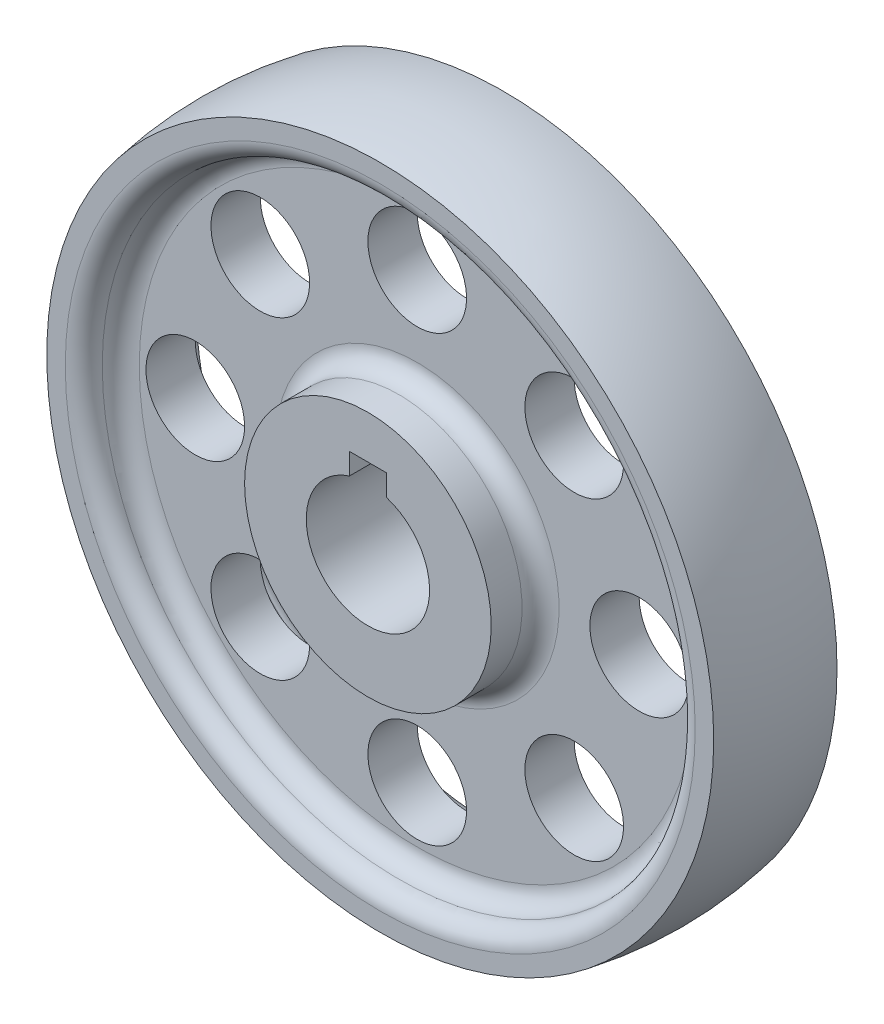
ISO-10303-21;
HEADER;
FILE_DESCRIPTION(('STEP AP214'),'2;1');
FILE_NAME('part.step','',(''),(''),'','','');
FILE_SCHEMA(('AUTOMOTIVE_DESIGN { 1 0 10303 214 1 1 1 1 }'));
ENDSEC;
DATA;
#1=APPLICATION_CONTEXT('core data for automotive mechanical design processes');
#2=APPLICATION_PROTOCOL_DEFINITION('international standard','automotive_design',2000,#1);
#3=PRODUCT_CONTEXT('',#1,'mechanical');
#4=PRODUCT('Part','Part','',(#3));
#5=PRODUCT_RELATED_PRODUCT_CATEGORY('part','',(#4));
#6=PRODUCT_DEFINITION_FORMATION('','',#4);
#7=PRODUCT_DEFINITION_CONTEXT('part definition',#1,'design');
#8=PRODUCT_DEFINITION('design','',#6,#7);
#9=PRODUCT_DEFINITION_SHAPE('','',#8);
#10=(LENGTH_UNIT() NAMED_UNIT(*) SI_UNIT(.MILLI.,.METRE.));
#11=(NAMED_UNIT(*) PLANE_ANGLE_UNIT() SI_UNIT($,.RADIAN.));
#12=(NAMED_UNIT(*) SI_UNIT($,.STERADIAN.) SOLID_ANGLE_UNIT());
#13=UNCERTAINTY_MEASURE_WITH_UNIT(LENGTH_MEASURE(1.E-05),#10,'distance_accuracy_value','');
#14=(GEOMETRIC_REPRESENTATION_CONTEXT(3) GLOBAL_UNCERTAINTY_ASSIGNED_CONTEXT((#13)) GLOBAL_UNIT_ASSIGNED_CONTEXT((#10,
#11,#12)) REPRESENTATION_CONTEXT('',''));
#15=CARTESIAN_POINT('',(0.,0.,0.));
#16=DIRECTION('',(0.,0.,1.));
#17=DIRECTION('',(1.,0.,0.));
#18=AXIS2_PLACEMENT_3D('',#15,#16,#17);
#19=CARTESIAN_POINT('',(0.,0.,0.));
#20=DIRECTION('',(0.,0.,1.));
#21=DIRECTION('',(1.,0.,0.));
#22=AXIS2_PLACEMENT_3D('',#19,#20,#21);
#23=PLANE('',#22);
#24=CARTESIAN_POINT('',(25.4558441227154,25.455844122716,0.));
#25=DIRECTION('',(0.,0.,-1.));
#26=DIRECTION('',(-0.707106781186556,0.707106781186539,0.));
#27=AXIS2_PLACEMENT_3D('',#24,#25,#26);
#28=CIRCLE('',#27,8.);
#29=CARTESIAN_POINT('',(19.7989898732229,31.1126983722083,0.));
#30=VERTEX_POINT('',#29);
#31=EDGE_CURVE('E262',#30,#30,#28,.T.);
#32=ORIENTED_EDGE('',*,*,#31,.F.);
#33=EDGE_LOOP('',(#32));
#34=FACE_BOUND('',#33,.T.);
#35=CARTESIAN_POINT('',(36.,3.77079984595058E-13,0.));
#36=DIRECTION('',(0.,0.,-1.));
#37=DIRECTION('',(0.,1.,0.));
#38=AXIS2_PLACEMENT_3D('',#35,#36,#37);
#39=CIRCLE('',#38,8.);
#40=CARTESIAN_POINT('',(35.9999999999999,8.00000000000038,0.));
#41=VERTEX_POINT('',#40);
#42=EDGE_CURVE('E256',#41,#41,#39,.T.);
#43=ORIENTED_EDGE('',*,*,#42,.F.);
#44=EDGE_LOOP('',(#43));
#45=FACE_BOUND('',#44,.T.);
#46=CARTESIAN_POINT('',(25.4558441227159,-25.4558441227155,0.));
#47=DIRECTION('',(0.,0.,-1.));
#48=DIRECTION('',(0.707106781186541,0.707106781186554,0.));
#49=AXIS2_PLACEMENT_3D('',#46,#47,#48);
#50=CIRCLE('',#49,8.);
#51=CARTESIAN_POINT('',(31.1126983722083,-19.7989898732231,0.));
#52=VERTEX_POINT('',#51);
#53=EDGE_CURVE('E250',#52,#52,#50,.T.);
#54=ORIENTED_EDGE('',*,*,#53,.F.);
#55=EDGE_LOOP('',(#54));
#56=FACE_BOUND('',#55,.T.);
#57=CARTESIAN_POINT('',(2.51386656396706E-13,-36.,0.));
#58=DIRECTION('',(0.,0.,-1.));
#59=DIRECTION('',(1.,0.,0.));
#60=AXIS2_PLACEMENT_3D('',#57,#58,#59);
#61=CIRCLE('',#60,8.);
#62=CARTESIAN_POINT('',(8.00000000000025,-35.9999999999999,0.));
#63=VERTEX_POINT('',#62);
#64=EDGE_CURVE('E244',#63,#63,#61,.T.);
#65=ORIENTED_EDGE('',*,*,#64,.F.);
#66=EDGE_LOOP('',(#65));
#67=FACE_BOUND('',#66,.T.);
#68=CARTESIAN_POINT('',(-25.4558441227156,-25.4558441227158,0.));
#69=DIRECTION('',(0.,0.,-1.));
#70=DIRECTION('',(0.707106781186551,-0.707106781186544,0.));
#71=AXIS2_PLACEMENT_3D('',#68,#69,#70);
#72=CIRCLE('',#71,8.);
#73=CARTESIAN_POINT('',(-19.7989898732232,-31.1126983722082,0.));
#74=VERTEX_POINT('',#73);
#75=EDGE_CURVE('E238',#74,#74,#72,.T.);
#76=ORIENTED_EDGE('',*,*,#75,.F.);
#77=EDGE_LOOP('',(#76));
#78=FACE_BOUND('',#77,.T.);
#79=CARTESIAN_POINT('',(-36.,-1.25693328198353E-13,0.));
#80=DIRECTION('',(0.,0.,-1.));
#81=DIRECTION('',(0.,-1.,0.));
#82=AXIS2_PLACEMENT_3D('',#79,#80,#81);
#83=CIRCLE('',#82,8.);
#84=CARTESIAN_POINT('',(-36.,-8.00000000000012,0.));
#85=VERTEX_POINT('',#84);
#86=EDGE_CURVE('E232',#85,#85,#83,.T.);
#87=ORIENTED_EDGE('',*,*,#86,.F.);
#88=EDGE_LOOP('',(#87));
#89=FACE_BOUND('',#88,.T.);
#90=CARTESIAN_POINT('',(-25.4558441227158,25.4558441227157,0.));
#91=DIRECTION('',(0.,0.,-1.));
#92=DIRECTION('',(-0.707106781186546,-0.707106781186549,0.));
#93=AXIS2_PLACEMENT_3D('',#90,#91,#92);
#94=CIRCLE('',#93,8.);
#95=CARTESIAN_POINT('',(-31.1126983722081,19.7989898732233,0.));
#96=VERTEX_POINT('',#95);
#97=EDGE_CURVE('E226',#96,#96,#94,.T.);
#98=ORIENTED_EDGE('',*,*,#97,.F.);
#99=EDGE_LOOP('',(#98));
#100=FACE_BOUND('',#99,.T.);
#101=CARTESIAN_POINT('',(0.,36.,0.));
#102=DIRECTION('',(0.,0.,-1.));
#103=DIRECTION('',(-1.,0.,0.));
#104=AXIS2_PLACEMENT_3D('',#101,#102,#103);
#105=CIRCLE('',#104,8.);
#106=CARTESIAN_POINT('',(-8.,36.,0.));
#107=VERTEX_POINT('',#106);
#108=EDGE_CURVE('E147',#107,#107,#105,.T.);
#109=ORIENTED_EDGE('',*,*,#108,.F.);
#110=EDGE_LOOP('',(#109));
#111=FACE_BOUND('',#110,.T.);
#112=CARTESIAN_POINT('',(0.,0.,0.));
#113=DIRECTION('',(0.,0.,1.));
#114=DIRECTION('',(1.,0.,0.));
#115=AXIS2_PLACEMENT_3D('',#112,#113,#114);
#116=CIRCLE('',#115,45.0832691319598);
#117=CARTESIAN_POINT('',(45.0832691319598,0.,0.));
#118=VERTEX_POINT('',#117);
#119=EDGE_CURVE('E129',#118,#118,#116,.F.);
#120=ORIENTED_EDGE('',*,*,#119,.T.);
#121=EDGE_LOOP('',(#120));
#122=FACE_BOUND('',#121,.T.);
#123=CARTESIAN_POINT('',(0.,0.,0.));
#124=DIRECTION('',(0.,0.,1.));
#125=DIRECTION('',(1.,0.,0.));
#126=AXIS2_PLACEMENT_3D('',#123,#124,#125);
#127=CIRCLE('',#126,18.);
#128=CARTESIAN_POINT('',(18.,0.,0.));
#129=VERTEX_POINT('',#128);
#130=EDGE_CURVE('E123',#129,#129,#127,.T.);
#131=ORIENTED_EDGE('',*,*,#130,.T.);
#132=EDGE_LOOP('',(#131));
#133=FACE_BOUND('',#132,.T.);
#134=ADVANCED_FACE('F34',(#34,#45,#56,#67,#78,#89,#100,#111,#122,#133),#23,.F.);
#135=CARTESIAN_POINT('',(0.,0.,-8.));
#136=DIRECTION('',(0.,0.,1.));
#137=DIRECTION('',(1.,0.,0.));
#138=AXIS2_PLACEMENT_3D('',#135,#136,#137);
#139=CYLINDRICAL_SURFACE('',#138,15.);
#140=CARTESIAN_POINT('',(0.,0.,-3.));
#141=DIRECTION('',(0.,0.,1.));
#142=DIRECTION('',(1.,0.,0.));
#143=AXIS2_PLACEMENT_3D('',#140,#141,#142);
#144=CIRCLE('',#143,15.);
#145=CARTESIAN_POINT('',(15.,0.,-3.));
#146=VERTEX_POINT('',#145);
#147=EDGE_CURVE('E120',#146,#146,#144,.F.);
#148=ORIENTED_EDGE('',*,*,#147,.T.);
#149=EDGE_LOOP('',(#148));
#150=FACE_BOUND('',#149,.T.);
#151=CARTESIAN_POINT('',(0.,0.,-8.));
#152=DIRECTION('',(0.,0.,-1.));
#153=DIRECTION('',(-1.,0.,0.));
#154=AXIS2_PLACEMENT_3D('',#151,#152,#153);
#155=CIRCLE('',#154,15.);
#156=CARTESIAN_POINT('',(-15.,0.,-8.));
#157=VERTEX_POINT('',#156);
#158=EDGE_CURVE('E111',#157,#157,#155,.T.);
#159=ORIENTED_EDGE('',*,*,#158,.F.);
#160=EDGE_LOOP('',(#159));
#161=FACE_BOUND('',#160,.T.);
#162=ADVANCED_FACE('F165',(#150,#161),#139,.T.);
#163=CARTESIAN_POINT('',(0.,0.,-8.));
#164=DIRECTION('',(0.,0.,-1.));
#165=DIRECTION('',(-1.,0.,0.));
#166=AXIS2_PLACEMENT_3D('',#163,#164,#165);
#167=PLANE('',#166);
#168=DIRECTION('',(0.,-1.,0.));
#169=VECTOR('',#168,1.);
#170=CARTESIAN_POINT('',(3.,8.7201646090535,-8.));
#171=LINE('',#170,#169);
#172=CARTESIAN_POINT('',(3.,13.,-8.));
#173=VERTEX_POINT('',#172);
#174=CARTESIAN_POINT('',(3.,9.53939201416946,-8.));
#175=VERTEX_POINT('',#174);
#176=EDGE_CURVE('E103',#173,#175,#171,.T.);
#177=ORIENTED_EDGE('',*,*,#176,.F.);
#178=DIRECTION('',(1.,0.,0.));
#179=VECTOR('',#178,1.);
#180=CARTESIAN_POINT('',(3.,13.,-8.));
#181=LINE('',#180,#179);
#182=CARTESIAN_POINT('',(-3.,13.,-8.));
#183=VERTEX_POINT('',#182);
#184=EDGE_CURVE('E99',#183,#173,#181,.T.);
#185=ORIENTED_EDGE('',*,*,#184,.F.);
#186=DIRECTION('',(0.,1.,0.));
#187=VECTOR('',#186,1.);
#188=CARTESIAN_POINT('',(-3.,8.7201646090535,-8.));
#189=LINE('',#188,#187);
#190=CARTESIAN_POINT('',(-3.,9.53939201416946,-8.));
#191=VERTEX_POINT('',#190);
#192=EDGE_CURVE('E83',#191,#183,#189,.T.);
#193=ORIENTED_EDGE('',*,*,#192,.F.);
#194=CARTESIAN_POINT('',(0.,0.,-8.));
#195=DIRECTION('',(0.,0.,-1.));
#196=DIRECTION('',(-1.,0.,0.));
#197=AXIS2_PLACEMENT_3D('',#194,#195,#196);
#198=CIRCLE('',#197,10.);
#199=EDGE_CURVE('E108',#175,#191,#198,.T.);
#200=ORIENTED_EDGE('',*,*,#199,.F.);
#201=EDGE_LOOP('',(#177,#185,#193,#200));
#202=FACE_BOUND('',#201,.T.);
#203=ORIENTED_EDGE('',*,*,#158,.T.);
#204=EDGE_LOOP('',(#203));
#205=FACE_BOUND('',#204,.T.);
#206=ADVANCED_FACE('F171',(#202,#205),#167,.T.);
#207=CARTESIAN_POINT('',(0.,0.,-3.));
#208=DIRECTION('',(0.,0.,1.));
#209=DIRECTION('',(1.,0.,0.));
#210=AXIS2_PLACEMENT_3D('',#207,#208,#209);
#211=TOROIDAL_SURFACE('',#210,18.,3.);
#212=ORIENTED_EDGE('',*,*,#130,.F.);
#213=EDGE_LOOP('',(#212));
#214=FACE_BOUND('',#213,.T.);
#215=ORIENTED_EDGE('',*,*,#147,.F.);
#216=EDGE_LOOP('',(#215));
#217=FACE_BOUND('',#216,.T.);
#218=ADVANCED_FACE('F183',(#214,#217),#211,.F.);
#219=CARTESIAN_POINT('',(0.,0.,8.));
#220=DIRECTION('',(0.,0.,-1.));
#221=DIRECTION('',(-1.,0.,0.));
#222=AXIS2_PLACEMENT_3D('',#219,#220,#221);
#223=PLANE('',#222);
#224=CARTESIAN_POINT('',(0.,0.,8.));
#225=DIRECTION('',(0.,0.,-1.));
#226=DIRECTION('',(-1.,0.,0.));
#227=AXIS2_PLACEMENT_3D('',#224,#225,#226);
#228=CIRCLE('',#227,23.);
#229=CARTESIAN_POINT('',(-23.,0.,8.));
#230=VERTEX_POINT('',#229);
#231=EDGE_CURVE('E42',#230,#230,#228,.T.);
#232=ORIENTED_EDGE('',*,*,#231,.T.);
#233=EDGE_LOOP('',(#232));
#234=FACE_BOUND('',#233,.T.);
#235=CARTESIAN_POINT('',(25.4558441227154,25.455844122716,8.));
#236=DIRECTION('',(0.,0.,-1.));
#237=DIRECTION('',(-0.707106781186556,0.707106781186539,0.));
#238=AXIS2_PLACEMENT_3D('',#235,#236,#237);
#239=CIRCLE('',#238,8.);
#240=CARTESIAN_POINT('',(19.7989898732229,31.1126983722083,8.));
#241=VERTEX_POINT('',#240);
#242=EDGE_CURVE('E259',#241,#241,#239,.T.);
#243=ORIENTED_EDGE('',*,*,#242,.T.);
#244=EDGE_LOOP('',(#243));
#245=FACE_BOUND('',#244,.T.);
#246=CARTESIAN_POINT('',(36.,3.77079984595058E-13,8.));
#247=DIRECTION('',(0.,0.,-1.));
#248=DIRECTION('',(0.,1.,0.));
#249=AXIS2_PLACEMENT_3D('',#246,#247,#248);
#250=CIRCLE('',#249,8.);
#251=CARTESIAN_POINT('',(35.9999999999999,8.00000000000038,8.));
#252=VERTEX_POINT('',#251);
#253=EDGE_CURVE('E253',#252,#252,#250,.T.);
#254=ORIENTED_EDGE('',*,*,#253,.T.);
#255=EDGE_LOOP('',(#254));
#256=FACE_BOUND('',#255,.T.);
#257=CARTESIAN_POINT('',(25.4558441227159,-25.4558441227155,8.));
#258=DIRECTION('',(0.,0.,-1.));
#259=DIRECTION('',(0.707106781186541,0.707106781186554,0.));
#260=AXIS2_PLACEMENT_3D('',#257,#258,#259);
#261=CIRCLE('',#260,8.);
#262=CARTESIAN_POINT('',(31.1126983722083,-19.7989898732231,8.));
#263=VERTEX_POINT('',#262);
#264=EDGE_CURVE('E247',#263,#263,#261,.T.);
#265=ORIENTED_EDGE('',*,*,#264,.T.);
#266=EDGE_LOOP('',(#265));
#267=FACE_BOUND('',#266,.T.);
#268=CARTESIAN_POINT('',(2.51386656396706E-13,-36.,8.));
#269=DIRECTION('',(0.,0.,-1.));
#270=DIRECTION('',(1.,0.,0.));
#271=AXIS2_PLACEMENT_3D('',#268,#269,#270);
#272=CIRCLE('',#271,8.);
#273=CARTESIAN_POINT('',(8.00000000000025,-35.9999999999999,8.));
#274=VERTEX_POINT('',#273);
#275=EDGE_CURVE('E241',#274,#274,#272,.T.);
#276=ORIENTED_EDGE('',*,*,#275,.T.);
#277=EDGE_LOOP('',(#276));
#278=FACE_BOUND('',#277,.T.);
#279=CARTESIAN_POINT('',(-25.4558441227156,-25.4558441227158,8.));
#280=DIRECTION('',(0.,0.,-1.));
#281=DIRECTION('',(0.707106781186551,-0.707106781186544,0.));
#282=AXIS2_PLACEMENT_3D('',#279,#280,#281);
#283=CIRCLE('',#282,8.);
#284=CARTESIAN_POINT('',(-19.7989898732232,-31.1126983722082,8.));
#285=VERTEX_POINT('',#284);
#286=EDGE_CURVE('E235',#285,#285,#283,.T.);
#287=ORIENTED_EDGE('',*,*,#286,.T.);
#288=EDGE_LOOP('',(#287));
#289=FACE_BOUND('',#288,.T.);
#290=CARTESIAN_POINT('',(-36.,-1.25693328198353E-13,8.));
#291=DIRECTION('',(0.,0.,-1.));
#292=DIRECTION('',(0.,-1.,0.));
#293=AXIS2_PLACEMENT_3D('',#290,#291,#292);
#294=CIRCLE('',#293,8.);
#295=CARTESIAN_POINT('',(-36.,-8.00000000000012,8.));
#296=VERTEX_POINT('',#295);
#297=EDGE_CURVE('E229',#296,#296,#294,.T.);
#298=ORIENTED_EDGE('',*,*,#297,.T.);
#299=EDGE_LOOP('',(#298));
#300=FACE_BOUND('',#299,.T.);
#301=CARTESIAN_POINT('',(-25.4558441227158,25.4558441227157,8.));
#302=DIRECTION('',(0.,0.,-1.));
#303=DIRECTION('',(-0.707106781186546,-0.707106781186549,0.));
#304=AXIS2_PLACEMENT_3D('',#301,#302,#303);
#305=CIRCLE('',#304,8.);
#306=CARTESIAN_POINT('',(-31.1126983722081,19.7989898732233,8.));
#307=VERTEX_POINT('',#306);
#308=EDGE_CURVE('E223',#307,#307,#305,.T.);
#309=ORIENTED_EDGE('',*,*,#308,.T.);
#310=EDGE_LOOP('',(#309));
#311=FACE_BOUND('',#310,.T.);
#312=CARTESIAN_POINT('',(0.,36.,8.));
#313=DIRECTION('',(0.,0.,-1.));
#314=DIRECTION('',(-1.,0.,0.));
#315=AXIS2_PLACEMENT_3D('',#312,#313,#314);
#316=CIRCLE('',#315,8.);
#317=CARTESIAN_POINT('',(-8.,36.,8.));
#318=VERTEX_POINT('',#317);
#319=EDGE_CURVE('E145',#318,#318,#316,.T.);
#320=ORIENTED_EDGE('',*,*,#319,.T.);
#321=EDGE_LOOP('',(#320));
#322=FACE_BOUND('',#321,.T.);
#323=CARTESIAN_POINT('',(0.,0.,8.));
#324=DIRECTION('',(0.,0.,-1.));
#325=DIRECTION('',(-1.,0.,0.));
#326=AXIS2_PLACEMENT_3D('',#323,#324,#325);
#327=CIRCLE('',#326,45.0832691319598);
#328=CARTESIAN_POINT('',(-45.0832691319598,0.,8.00000000000001));
#329=VERTEX_POINT('',#328);
#330=EDGE_CURVE('E140',#329,#329,#327,.F.);
#331=ORIENTED_EDGE('',*,*,#330,.T.);
#332=EDGE_LOOP('',(#331));
#333=FACE_BOUND('',#332,.T.);
#334=ADVANCED_FACE('F151',(#234,#245,#256,#267,#278,#289,#300,#311,#322,#333),#223,.F.);
#335=CARTESIAN_POINT('',(54.0832691319598,0.,-6.));
#336=DIRECTION('',(0.,0.,1.));
#337=DIRECTION('',(1.,0.,0.));
#338=AXIS2_PLACEMENT_3D('',#335,#336,#337);
#339=PLANE('',#338);
#340=CARTESIAN_POINT('',(0.,0.,-5.99999999999999));
#341=DIRECTION('',(0.,0.,1.));
#342=DIRECTION('',(1.,0.,0.));
#343=AXIS2_PLACEMENT_3D('',#340,#341,#342);
#344=CIRCLE('',#343,51.0832691319598);
#345=CARTESIAN_POINT('',(51.0832691319598,0.,-6.));
#346=VERTEX_POINT('',#345);
#347=EDGE_CURVE('E126',#346,#346,#344,.T.);
#348=ORIENTED_EDGE('',*,*,#347,.T.);
#349=EDGE_LOOP('',(#348));
#350=FACE_BOUND('',#349,.T.);
#351=CARTESIAN_POINT('',(0.,0.,-5.99999999999999));
#352=DIRECTION('',(0.,0.,-1.));
#353=DIRECTION('',(-1.,0.,0.));
#354=AXIS2_PLACEMENT_3D('',#351,#352,#353);
#355=CIRCLE('',#354,54.0832691319598);
#356=CARTESIAN_POINT('',(54.0832691319598,0.,-6.));
#357=VERTEX_POINT('',#356);
#358=EDGE_CURVE('E105',#357,#357,#355,.T.);
#359=ORIENTED_EDGE('',*,*,#358,.T.);
#360=EDGE_LOOP('',(#359));
#361=FACE_BOUND('',#360,.T.);
#362=ADVANCED_FACE('F268',(#350,#361),#339,.F.);
#363=CARTESIAN_POINT('',(0.,0.,4.));
#364=DIRECTION('',(0.,0.,-1.));
#365=DIRECTION('',(1.,0.,0.));
#366=AXIS2_PLACEMENT_3D('',#363,#364,#365);
#367=SPHERICAL_SURFACE('',#366,55.);
#368=CARTESIAN_POINT('',(0.,0.,14.));
#369=DIRECTION('',(0.,0.,-1.));
#370=DIRECTION('',(-1.,0.,0.));
#371=AXIS2_PLACEMENT_3D('',#368,#369,#370);
#372=CIRCLE('',#371,54.0832691319598);
#373=CARTESIAN_POINT('',(54.0832691319598,0.,14.));
#374=VERTEX_POINT('',#373);
#375=EDGE_CURVE('E136',#374,#374,#372,.T.);
#376=CARTESIAN_POINT('',(54.0832691319598,0.,-6.));
#377=CARTESIAN_POINT('',(54.1213598408052,0.,-5.7939933029112));
#378=CARTESIAN_POINT('',(54.158273401531,0.,-5.58776895218788));
#379=CARTESIAN_POINT('',(54.2297416495209,0.,-5.17491191417428));
#380=CARTESIAN_POINT('',(54.264296336785,0.,-4.96827922688401));
#381=CARTESIAN_POINT('',(54.3310422606294,0.,-4.55463248643864));
#382=CARTESIAN_POINT('',(54.3632334972097,0.,-4.34761843328354));
#383=CARTESIAN_POINT('',(54.4252483336158,0.,-3.9332359958963));
#384=CARTESIAN_POINT('',(54.4550719334416,0.,-3.72586761166416));
#385=CARTESIAN_POINT('',(54.512347597318,0.,-3.31080358935072));
#386=CARTESIAN_POINT('',(54.5397996613685,0.,-3.10310795126943));
#387=CARTESIAN_POINT('',(54.5923286702727,0.,-2.68741654224396));
#388=CARTESIAN_POINT('',(54.6174056151264,0.,-2.47942077129978));
#389=CARTESIAN_POINT('',(54.6651811107694,0.,-2.06315625645112));
#390=CARTESIAN_POINT('',(54.6878796615586,0.,-1.85488751254664));
#391=CARTESIAN_POINT('',(54.7308954051996,0.,-1.43810424739825));
#392=CARTESIAN_POINT('',(54.7512125980513,0.,-1.22958972615433));
#393=CARTESIAN_POINT('',(54.7894629727867,0.,-0.812342134021659));
#394=CARTESIAN_POINT('',(54.8073961546702,0.,-0.603609063132902));
#395=CARTESIAN_POINT('',(54.8408761657717,0.,-0.185951627948502));
#396=CARTESIAN_POINT('',(54.8564229949896,0.,0.02297273634714));
#397=CARTESIAN_POINT('',(54.8851282706626,0.,0.440985477129793));
#398=CARTESIAN_POINT('',(54.8982867171177,0.,0.650073853616804));
#399=CARTESIAN_POINT('',(54.9222135090435,0.,1.06838731614969));
#400=CARTESIAN_POINT('',(54.9329818545143,0.,1.27761240219556));
#401=CARTESIAN_POINT('',(54.9521270383475,0.,1.6961719633623));
#402=CARTESIAN_POINT('',(54.9605038767099,0.,1.90550643848317));
#403=CARTESIAN_POINT('',(54.9748649524839,0.,2.32425744303208));
#404=CARTESIAN_POINT('',(54.9808491898955,0.,2.53367397246011));
#405=CARTESIAN_POINT('',(54.9904242823499,0.,2.9525617401409));
#406=CARTESIAN_POINT('',(54.9940151373927,0.,3.16203297839366));
#407=CARTESIAN_POINT('',(54.9988029962177,0.,3.58100281109761));
#408=CARTESIAN_POINT('',(55.,0.,3.79050140554881));
#409=CARTESIAN_POINT('',(55.,0.,4.2094985944512));
#410=CARTESIAN_POINT('',(54.9988029962177,0.,4.41899718890239));
#411=CARTESIAN_POINT('',(54.9940151373927,0.,4.83796702160634));
#412=CARTESIAN_POINT('',(54.9904242823499,0.,5.0474382598591));
#413=CARTESIAN_POINT('',(54.9808491898955,0.,5.46632602753989));
#414=CARTESIAN_POINT('',(54.9748649524839,0.,5.67574255696792));
#415=CARTESIAN_POINT('',(54.9605038767099,0.,6.09449356151683));
#416=CARTESIAN_POINT('',(54.9521270383475,0.,6.3038280366377));
#417=CARTESIAN_POINT('',(54.9329818545143,0.,6.72238759780444));
#418=CARTESIAN_POINT('',(54.9222135090435,0.,6.93161268385032));
#419=CARTESIAN_POINT('',(54.8982867171177,0.,7.3499261463832));
#420=CARTESIAN_POINT('',(54.8851282706626,0.,7.55901452287021));
#421=CARTESIAN_POINT('',(54.8564229949896,0.,7.97702726365286));
#422=CARTESIAN_POINT('',(54.8408761657717,0.,8.1859516279485));
#423=CARTESIAN_POINT('',(54.8073961546702,0.,8.6036090631329));
#424=CARTESIAN_POINT('',(54.7894629727867,0.,8.81234213402166));
#425=CARTESIAN_POINT('',(54.7512125980513,0.,9.22958972615433));
#426=CARTESIAN_POINT('',(54.7308954051996,0.,9.43810424739825));
#427=CARTESIAN_POINT('',(54.6878796615586,0.,9.85488751254664));
#428=CARTESIAN_POINT('',(54.6651811107694,0.,10.0631562564511));
#429=CARTESIAN_POINT('',(54.6174056151264,0.,10.4794207712998));
#430=CARTESIAN_POINT('',(54.5923286702727,0.,10.687416542244));
#431=CARTESIAN_POINT('',(54.5397996613685,0.,11.1031079512694));
#432=CARTESIAN_POINT('',(54.512347597318,0.,11.3108035893507));
#433=CARTESIAN_POINT('',(54.4550719334416,0.,11.7258676116642));
#434=CARTESIAN_POINT('',(54.4252483336158,0.,11.9332359958963));
#435=CARTESIAN_POINT('',(54.3632334972097,0.,12.3476184332835));
#436=CARTESIAN_POINT('',(54.3310422606294,0.,12.5546324864386));
#437=CARTESIAN_POINT('',(54.264296336785,0.,12.968279226884));
#438=CARTESIAN_POINT('',(54.2297416495209,0.,13.1749119141743));
#439=CARTESIAN_POINT('',(54.158273401531,0.,13.5877689521879));
#440=CARTESIAN_POINT('',(54.1213598408052,0.,13.7939933029112));
#441=CARTESIAN_POINT('',(54.0832691319598,0.,14.));
#442=B_SPLINE_CURVE_WITH_KNOTS('',3,(#376,#377,#378,#379,#380,#381,#382,#383,#384,#385,#386,
#387,#388,#389,#390,#391,#392,#393,#394,#395,#396,#397,#398,#399,#400,#401,#402,#403,#404,#405,
#406,#407,#408,#409,#410,#411,#412,#413,#414,#415,#416,#417,#418,#419,#420,#421,#422,#423,#424,
#425,#426,#427,#428,#429,#430,#431,#432,#433,#434,#435,#436,#437,#438,#439,#440,#441),
.UNSPECIFIED.,.F.,.F.,(4,2,2,2,2,2,2,2,2,2,2,2,2,2,2,2,2,2,2,2,2,2,2,2,2,2,2,2,2,2,2,2,4),(0.,
0.62849236385669,1.25698472771338,1.88547709157007,2.51396945542676,3.14246181928345,
3.77095418314014,4.39944654699682,5.02793891085351,5.6564312747102,6.28492363856689,
6.91341600242358,7.54190836628027,8.17040073013696,8.79889309399365,9.42738545785034,
10.055877821707,10.6843701855637,11.3128625494204,11.9413549132771,12.5698472771338,
13.1983396409905,13.8268320048472,14.4553243687039,15.0838167325605,15.7123090964172,
16.3408014602739,16.9692938241306,17.5977861879873,18.226278551844,18.8547709157007,
19.4832632795574,20.1117556434141),.UNSPECIFIED.);
#443=EDGE_CURVE('BSEAM213',#357,#374,#442,.T.);
#444=ORIENTED_EDGE('',*,*,#358,.F.);
#445=ORIENTED_EDGE('',*,*,#375,.T.);
#446=ORIENTED_EDGE('',*,*,#443,.T.);
#447=ORIENTED_EDGE('',*,*,#443,.F.);
#448=EDGE_LOOP('',(#444,#446,#445,#447));
#449=FACE_BOUND('',#448,.T.);
#450=ADVANCED_FACE('F213',(#449),#367,.T.);
#451=CARTESIAN_POINT('',(48.0832691319598,0.,14.));
#452=DIRECTION('',(0.,0.,-1.));
#453=DIRECTION('',(-1.,0.,0.));
#454=AXIS2_PLACEMENT_3D('',#451,#452,#453);
#455=PLANE('',#454);
#456=CARTESIAN_POINT('',(0.,0.,14.));
#457=DIRECTION('',(0.,0.,-1.));
#458=DIRECTION('',(-1.,0.,0.));
#459=AXIS2_PLACEMENT_3D('',#456,#457,#458);
#460=CIRCLE('',#459,51.0832691319598);
#461=CARTESIAN_POINT('',(-51.0832691319598,0.,14.));
#462=VERTEX_POINT('',#461);
#463=EDGE_CURVE('E132',#462,#462,#460,.T.);
#464=ORIENTED_EDGE('',*,*,#463,.T.);
#465=EDGE_LOOP('',(#464));
#466=FACE_BOUND('',#465,.T.);
#467=ORIENTED_EDGE('',*,*,#375,.F.);
#468=EDGE_LOOP('',(#467));
#469=FACE_BOUND('',#468,.T.);
#470=ADVANCED_FACE('F181',(#466,#469),#455,.F.);
#471=CARTESIAN_POINT('',(0.,0.,16.));
#472=DIRECTION('',(0.,0.,-1.));
#473=DIRECTION('',(-1.,0.,0.));
#474=AXIS2_PLACEMENT_3D('',#471,#472,#473);
#475=CYLINDRICAL_SURFACE('',#474,20.);
#476=CARTESIAN_POINT('',(0.,0.,11.));
#477=DIRECTION('',(0.,0.,-1.));
#478=DIRECTION('',(-1.,0.,0.));
#479=AXIS2_PLACEMENT_3D('',#476,#477,#478);
#480=CIRCLE('',#479,20.);
#481=CARTESIAN_POINT('',(-20.,0.,11.));
#482=VERTEX_POINT('',#481);
#483=EDGE_CURVE('E11',#482,#482,#480,.F.);
#484=ORIENTED_EDGE('',*,*,#483,.T.);
#485=EDGE_LOOP('',(#484));
#486=FACE_BOUND('',#485,.T.);
#487=CARTESIAN_POINT('',(0.,0.,16.));
#488=DIRECTION('',(0.,0.,1.));
#489=DIRECTION('',(1.,0.,0.));
#490=AXIS2_PLACEMENT_3D('',#487,#488,#489);
#491=CIRCLE('',#490,20.);
#492=CARTESIAN_POINT('',(20.,0.,16.));
#493=VERTEX_POINT('',#492);
#494=EDGE_CURVE('E115',#493,#493,#491,.T.);
#495=ORIENTED_EDGE('',*,*,#494,.F.);
#496=EDGE_LOOP('',(#495));
#497=FACE_BOUND('',#496,.T.);
#498=ADVANCED_FACE('F178',(#486,#497),#475,.T.);
#499=CARTESIAN_POINT('',(0.,0.,16.));
#500=DIRECTION('',(0.,0.,1.));
#501=DIRECTION('',(1.,0.,0.));
#502=AXIS2_PLACEMENT_3D('',#499,#500,#501);
#503=PLANE('',#502);
#504=DIRECTION('',(0.,-1.,0.));
#505=VECTOR('',#504,1.);
#506=CARTESIAN_POINT('',(3.,8.7201646090535,16.));
#507=LINE('',#506,#505);
#508=CARTESIAN_POINT('',(3.,13.,16.));
#509=VERTEX_POINT('',#508);
#510=CARTESIAN_POINT('',(3.,9.53939201416946,16.));
#511=VERTEX_POINT('',#510);
#512=EDGE_CURVE('E97',#509,#511,#507,.T.);
#513=ORIENTED_EDGE('',*,*,#512,.T.);
#514=CARTESIAN_POINT('',(0.,0.,16.));
#515=DIRECTION('',(0.,0.,-1.));
#516=DIRECTION('',(-1.,0.,0.));
#517=AXIS2_PLACEMENT_3D('',#514,#515,#516);
#518=CIRCLE('',#517,10.);
#519=CARTESIAN_POINT('',(-3.,9.53939201416946,16.));
#520=VERTEX_POINT('',#519);
#521=EDGE_CURVE('E96',#511,#520,#518,.T.);
#522=ORIENTED_EDGE('',*,*,#521,.T.);
#523=DIRECTION('',(0.,1.,0.));
#524=VECTOR('',#523,1.);
#525=CARTESIAN_POINT('',(-3.,8.7201646090535,16.));
#526=LINE('',#525,#524);
#527=CARTESIAN_POINT('',(-3.,13.,16.));
#528=VERTEX_POINT('',#527);
#529=EDGE_CURVE('E80',#520,#528,#526,.T.);
#530=ORIENTED_EDGE('',*,*,#529,.T.);
#531=DIRECTION('',(1.,0.,0.));
#532=VECTOR('',#531,1.);
#533=CARTESIAN_POINT('',(3.,13.,16.));
#534=LINE('',#533,#532);
#535=EDGE_CURVE('E88',#528,#509,#534,.T.);
#536=ORIENTED_EDGE('',*,*,#535,.T.);
#537=EDGE_LOOP('',(#513,#522,#530,#536));
#538=FACE_BOUND('',#537,.T.);
#539=ORIENTED_EDGE('',*,*,#494,.T.);
#540=EDGE_LOOP('',(#539));
#541=FACE_BOUND('',#540,.T.);
#542=ADVANCED_FACE('F94',(#538,#541),#503,.T.);
#543=CARTESIAN_POINT('',(3.,13.,16.));
#544=DIRECTION('',(0.,1.,0.));
#545=DIRECTION('',(-1.,0.,0.));
#546=AXIS2_PLACEMENT_3D('',#543,#544,#545);
#547=PLANE('',#546);
#548=DIRECTION('',(0.,0.,-1.));
#549=VECTOR('',#548,1.);
#550=CARTESIAN_POINT('',(-3.,13.,16.));
#551=LINE('',#550,#549);
#552=EDGE_CURVE('E76',#528,#183,#551,.T.);
#553=ORIENTED_EDGE('',*,*,#552,.T.);
#554=ORIENTED_EDGE('',*,*,#184,.T.);
#555=DIRECTION('',(0.,0.,-1.));
#556=VECTOR('',#555,1.);
#557=CARTESIAN_POINT('',(3.,13.,16.));
#558=LINE('',#557,#556);
#559=EDGE_CURVE('E87',#509,#173,#558,.T.);
#560=ORIENTED_EDGE('',*,*,#559,.F.);
#561=ORIENTED_EDGE('',*,*,#535,.F.);
#562=EDGE_LOOP('',(#553,#554,#560,#561));
#563=FACE_BOUND('',#562,.T.);
#564=ADVANCED_FACE('F91',(#563),#547,.F.);
#565=CARTESIAN_POINT('',(-3.,8.7201646090535,16.));
#566=DIRECTION('',(-1.,0.,0.));
#567=DIRECTION('',(0.,0.,1.));
#568=AXIS2_PLACEMENT_3D('',#565,#566,#567);
#569=PLANE('',#568);
#570=ORIENTED_EDGE('',*,*,#529,.F.);
#571=DIRECTION('',(0.,0.,-1.));
#572=VECTOR('',#571,1.);
#573=CARTESIAN_POINT('',(-3.,9.53939201416946,16.));
#574=LINE('',#573,#572);
#575=EDGE_CURVE('E49',#191,#520,#574,.F.);
#576=ORIENTED_EDGE('',*,*,#575,.F.);
#577=ORIENTED_EDGE('',*,*,#192,.T.);
#578=ORIENTED_EDGE('',*,*,#552,.F.);
#579=EDGE_LOOP('',(#570,#576,#577,#578));
#580=FACE_BOUND('',#579,.T.);
#581=ADVANCED_FACE('F78',(#580),#569,.F.);
#582=CARTESIAN_POINT('',(3.,8.7201646090535,16.));
#583=DIRECTION('',(1.,0.,0.));
#584=DIRECTION('',(0.,0.,-1.));
#585=AXIS2_PLACEMENT_3D('',#582,#583,#584);
#586=PLANE('',#585);
#587=ORIENTED_EDGE('',*,*,#559,.T.);
#588=ORIENTED_EDGE('',*,*,#176,.T.);
#589=DIRECTION('',(0.,0.,-1.));
#590=VECTOR('',#589,1.);
#591=CARTESIAN_POINT('',(3.,9.53939201416946,16.));
#592=LINE('',#591,#590);
#593=EDGE_CURVE('E57',#511,#175,#592,.T.);
#594=ORIENTED_EDGE('',*,*,#593,.F.);
#595=ORIENTED_EDGE('',*,*,#512,.F.);
#596=EDGE_LOOP('',(#587,#588,#594,#595));
#597=FACE_BOUND('',#596,.T.);
#598=ADVANCED_FACE('F307',(#597),#586,.F.);
#599=CARTESIAN_POINT('',(0.,0.,16.));
#600=DIRECTION('',(0.,0.,-1.));
#601=DIRECTION('',(-1.,0.,0.));
#602=AXIS2_PLACEMENT_3D('',#599,#600,#601);
#603=CYLINDRICAL_SURFACE('',#602,10.);
#604=ORIENTED_EDGE('',*,*,#593,.T.);
#605=ORIENTED_EDGE('',*,*,#199,.T.);
#606=ORIENTED_EDGE('',*,*,#575,.T.);
#607=ORIENTED_EDGE('',*,*,#521,.F.);
#608=EDGE_LOOP('',(#604,#605,#606,#607));
#609=FACE_BOUND('',#608,.T.);
#610=ADVANCED_FACE('F195',(#609),#603,.F.);
#611=CARTESIAN_POINT('',(0.,0.,-3.));
#612=DIRECTION('',(0.,0.,1.));
#613=DIRECTION('',(1.,0.,0.));
#614=AXIS2_PLACEMENT_3D('',#611,#612,#613);
#615=TOROIDAL_SURFACE('',#614,45.0832691319598,3.);
#616=ORIENTED_EDGE('',*,*,#119,.F.);
#617=EDGE_LOOP('',(#616));
#618=FACE_BOUND('',#617,.T.);
#619=CARTESIAN_POINT('',(0.,0.,-3.));
#620=DIRECTION('',(0.,0.,1.));
#621=DIRECTION('',(1.,0.,0.));
#622=AXIS2_PLACEMENT_3D('',#619,#620,#621);
#623=CIRCLE('',#622,48.0832691319598);
#624=CARTESIAN_POINT('',(48.0832691319598,0.,-3.));
#625=VERTEX_POINT('',#624);
#626=EDGE_CURVE('E133',#625,#625,#623,.T.);
#627=ORIENTED_EDGE('',*,*,#626,.F.);
#628=EDGE_LOOP('',(#627));
#629=FACE_BOUND('',#628,.T.);
#630=ADVANCED_FACE('F191',(#618,#629),#615,.F.);
#631=CARTESIAN_POINT('',(0.,0.,-2.99999999999999));
#632=DIRECTION('',(0.,0.,1.));
#633=DIRECTION('',(1.,0.,0.));
#634=AXIS2_PLACEMENT_3D('',#631,#632,#633);
#635=TOROIDAL_SURFACE('',#634,51.0832691319598,3.);
#636=ORIENTED_EDGE('',*,*,#347,.F.);
#637=EDGE_LOOP('',(#636));
#638=FACE_BOUND('',#637,.T.);
#639=ORIENTED_EDGE('',*,*,#626,.T.);
#640=EDGE_LOOP('',(#639));
#641=FACE_BOUND('',#640,.T.);
#642=ADVANCED_FACE('F187',(#638,#641),#635,.T.);
#643=CARTESIAN_POINT('',(0.,0.,11.));
#644=DIRECTION('',(0.,0.,-1.));
#645=DIRECTION('',(-1.,0.,0.));
#646=AXIS2_PLACEMENT_3D('',#643,#644,#645);
#647=TOROIDAL_SURFACE('',#646,45.0832691319598,3.);
#648=ORIENTED_EDGE('',*,*,#330,.F.);
#649=EDGE_LOOP('',(#648));
#650=FACE_BOUND('',#649,.T.);
#651=CARTESIAN_POINT('',(0.,0.,11.));
#652=DIRECTION('',(0.,0.,-1.));
#653=DIRECTION('',(-1.,0.,0.));
#654=AXIS2_PLACEMENT_3D('',#651,#652,#653);
#655=CIRCLE('',#654,48.0832691319598);
#656=CARTESIAN_POINT('',(-48.0832691319598,0.,11.));
#657=VERTEX_POINT('',#656);
#658=EDGE_CURVE('E137',#657,#657,#655,.T.);
#659=ORIENTED_EDGE('',*,*,#658,.F.);
#660=EDGE_LOOP('',(#659));
#661=FACE_BOUND('',#660,.T.);
#662=ADVANCED_FACE('F190',(#650,#661),#647,.F.);
#663=CARTESIAN_POINT('',(0.,0.,11.));
#664=DIRECTION('',(0.,0.,-1.));
#665=DIRECTION('',(-1.,0.,0.));
#666=AXIS2_PLACEMENT_3D('',#663,#664,#665);
#667=TOROIDAL_SURFACE('',#666,51.0832691319598,3.);
#668=ORIENTED_EDGE('',*,*,#658,.T.);
#669=EDGE_LOOP('',(#668));
#670=FACE_BOUND('',#669,.T.);
#671=ORIENTED_EDGE('',*,*,#463,.F.);
#672=EDGE_LOOP('',(#671));
#673=FACE_BOUND('',#672,.T.);
#674=ADVANCED_FACE('F197',(#670,#673),#667,.T.);
#675=CARTESIAN_POINT('',(0.,36.,16.));
#676=DIRECTION('',(0.,0.,-1.));
#677=DIRECTION('',(-1.,0.,0.));
#678=AXIS2_PLACEMENT_3D('',#675,#676,#677);
#679=CYLINDRICAL_SURFACE('',#678,8.);
#680=ORIENTED_EDGE('',*,*,#108,.T.);
#681=EDGE_LOOP('',(#680));
#682=FACE_BOUND('',#681,.T.);
#683=ORIENTED_EDGE('',*,*,#319,.F.);
#684=EDGE_LOOP('',(#683));
#685=FACE_BOUND('',#684,.T.);
#686=ADVANCED_FACE('F199',(#682,#685),#679,.F.);
#687=CARTESIAN_POINT('',(-25.4558441227158,25.4558441227157,16.));
#688=DIRECTION('',(0.,0.,-1.));
#689=DIRECTION('',(-0.707106781186546,-0.707106781186549,0.));
#690=AXIS2_PLACEMENT_3D('',#687,#688,#689);
#691=CYLINDRICAL_SURFACE('',#690,8.);
#692=ORIENTED_EDGE('',*,*,#97,.T.);
#693=EDGE_LOOP('',(#692));
#694=FACE_BOUND('',#693,.T.);
#695=ORIENTED_EDGE('',*,*,#308,.F.);
#696=EDGE_LOOP('',(#695));
#697=FACE_BOUND('',#696,.T.);
#698=ADVANCED_FACE('F286',(#694,#697),#691,.F.);
#699=CARTESIAN_POINT('',(-36.,-1.25693328198353E-13,16.));
#700=DIRECTION('',(0.,0.,-1.));
#701=DIRECTION('',(0.,-1.,0.));
#702=AXIS2_PLACEMENT_3D('',#699,#700,#701);
#703=CYLINDRICAL_SURFACE('',#702,8.);
#704=ORIENTED_EDGE('',*,*,#86,.T.);
#705=EDGE_LOOP('',(#704));
#706=FACE_BOUND('',#705,.T.);
#707=ORIENTED_EDGE('',*,*,#297,.F.);
#708=EDGE_LOOP('',(#707));
#709=FACE_BOUND('',#708,.T.);
#710=ADVANCED_FACE('F292',(#706,#709),#703,.F.);
#711=CARTESIAN_POINT('',(-25.4558441227156,-25.4558441227158,16.));
#712=DIRECTION('',(0.,0.,-1.));
#713=DIRECTION('',(0.707106781186551,-0.707106781186544,0.));
#714=AXIS2_PLACEMENT_3D('',#711,#712,#713);
#715=CYLINDRICAL_SURFACE('',#714,8.);
#716=ORIENTED_EDGE('',*,*,#75,.T.);
#717=EDGE_LOOP('',(#716));
#718=FACE_BOUND('',#717,.T.);
#719=ORIENTED_EDGE('',*,*,#286,.F.);
#720=EDGE_LOOP('',(#719));
#721=FACE_BOUND('',#720,.T.);
#722=ADVANCED_FACE('F422',(#718,#721),#715,.F.);
#723=CARTESIAN_POINT('',(2.51386656396706E-13,-36.,16.));
#724=DIRECTION('',(0.,0.,-1.));
#725=DIRECTION('',(1.,0.,0.));
#726=AXIS2_PLACEMENT_3D('',#723,#724,#725);
#727=CYLINDRICAL_SURFACE('',#726,8.);
#728=ORIENTED_EDGE('',*,*,#64,.T.);
#729=EDGE_LOOP('',(#728));
#730=FACE_BOUND('',#729,.T.);
#731=ORIENTED_EDGE('',*,*,#275,.F.);
#732=EDGE_LOOP('',(#731));
#733=FACE_BOUND('',#732,.T.);
#734=ADVANCED_FACE('F433',(#730,#733),#727,.F.);
#735=CARTESIAN_POINT('',(25.4558441227159,-25.4558441227155,16.));
#736=DIRECTION('',(0.,0.,-1.));
#737=DIRECTION('',(0.707106781186541,0.707106781186554,0.));
#738=AXIS2_PLACEMENT_3D('',#735,#736,#737);
#739=CYLINDRICAL_SURFACE('',#738,8.);
#740=ORIENTED_EDGE('',*,*,#53,.T.);
#741=EDGE_LOOP('',(#740));
#742=FACE_BOUND('',#741,.T.);
#743=ORIENTED_EDGE('',*,*,#264,.F.);
#744=EDGE_LOOP('',(#743));
#745=FACE_BOUND('',#744,.T.);
#746=ADVANCED_FACE('F444',(#742,#745),#739,.F.);
#747=CARTESIAN_POINT('',(36.,3.77079984595058E-13,16.));
#748=DIRECTION('',(0.,0.,-1.));
#749=DIRECTION('',(0.,1.,0.));
#750=AXIS2_PLACEMENT_3D('',#747,#748,#749);
#751=CYLINDRICAL_SURFACE('',#750,8.);
#752=ORIENTED_EDGE('',*,*,#42,.T.);
#753=EDGE_LOOP('',(#752));
#754=FACE_BOUND('',#753,.T.);
#755=ORIENTED_EDGE('',*,*,#253,.F.);
#756=EDGE_LOOP('',(#755));
#757=FACE_BOUND('',#756,.T.);
#758=ADVANCED_FACE('F160',(#754,#757),#751,.F.);
#759=CARTESIAN_POINT('',(25.4558441227154,25.455844122716,16.));
#760=DIRECTION('',(0.,0.,-1.));
#761=DIRECTION('',(-0.707106781186556,0.707106781186539,0.));
#762=AXIS2_PLACEMENT_3D('',#759,#760,#761);
#763=CYLINDRICAL_SURFACE('',#762,8.);
#764=ORIENTED_EDGE('',*,*,#31,.T.);
#765=EDGE_LOOP('',(#764));
#766=FACE_BOUND('',#765,.T.);
#767=ORIENTED_EDGE('',*,*,#242,.F.);
#768=EDGE_LOOP('',(#767));
#769=FACE_BOUND('',#768,.T.);
#770=ADVANCED_FACE('F155',(#766,#769),#763,.F.);
#771=CARTESIAN_POINT('',(0.,0.,11.));
#772=DIRECTION('',(0.,0.,-1.));
#773=DIRECTION('',(-1.,0.,0.));
#774=AXIS2_PLACEMENT_3D('',#771,#772,#773);
#775=TOROIDAL_SURFACE('',#774,23.,3.);
#776=ORIENTED_EDGE('',*,*,#483,.F.);
#777=EDGE_LOOP('',(#776));
#778=FACE_BOUND('',#777,.T.);
#779=ORIENTED_EDGE('',*,*,#231,.F.);
#780=EDGE_LOOP('',(#779));
#781=FACE_BOUND('',#780,.T.);
#782=ADVANCED_FACE('F36',(#778,#781),#775,.F.);
#783=CLOSED_SHELL('',(#134,#162,#206,#218,#334,#362,#450,#470,#498,#542,#564,#581,#598,#610,
#630,#642,#662,#674,#686,#698,#710,#722,#734,#746,#758,#770,#782));
#784=MANIFOLD_SOLID_BREP('B2',#783);
#785=ADVANCED_BREP_SHAPE_REPRESENTATION('',(#18,#784),#14);
#786=SHAPE_DEFINITION_REPRESENTATION(#9,#785);
ENDSEC;
END-ISO-10303-21;
